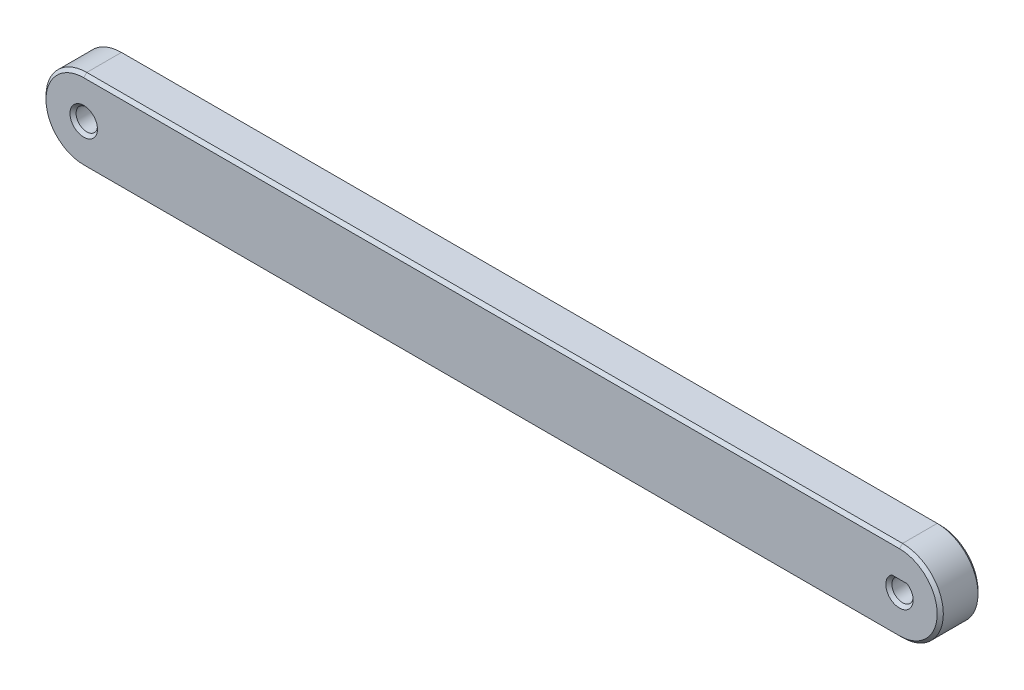
ISO-10303-21;
HEADER;
FILE_DESCRIPTION(('STEP AP214'),'2;1');
FILE_NAME('part.step','',(''),(''),'','','');
FILE_SCHEMA(('AUTOMOTIVE_DESIGN { 1 0 10303 214 1 1 1 1 }'));
ENDSEC;
DATA;
#1=APPLICATION_CONTEXT('core data for automotive mechanical design processes');
#2=APPLICATION_PROTOCOL_DEFINITION('international standard','automotive_design',2000,#1);
#3=PRODUCT_CONTEXT('',#1,'mechanical');
#4=PRODUCT('Part','Part','',(#3));
#5=PRODUCT_RELATED_PRODUCT_CATEGORY('part','',(#4));
#6=PRODUCT_DEFINITION_FORMATION('','',#4);
#7=PRODUCT_DEFINITION_CONTEXT('part definition',#1,'design');
#8=PRODUCT_DEFINITION('design','',#6,#7);
#9=PRODUCT_DEFINITION_SHAPE('','',#8);
#10=(LENGTH_UNIT() NAMED_UNIT(*) SI_UNIT(.MILLI.,.METRE.));
#11=(NAMED_UNIT(*) PLANE_ANGLE_UNIT() SI_UNIT($,.RADIAN.));
#12=(NAMED_UNIT(*) SI_UNIT($,.STERADIAN.) SOLID_ANGLE_UNIT());
#13=UNCERTAINTY_MEASURE_WITH_UNIT(LENGTH_MEASURE(1.E-05),#10,'distance_accuracy_value','');
#14=(GEOMETRIC_REPRESENTATION_CONTEXT(3) GLOBAL_UNCERTAINTY_ASSIGNED_CONTEXT((#13)) GLOBAL_UNIT_ASSIGNED_CONTEXT((#10,
#11,#12)) REPRESENTATION_CONTEXT('',''));
#15=CARTESIAN_POINT('',(0.,0.,0.));
#16=DIRECTION('',(0.,0.,1.));
#17=DIRECTION('',(1.,0.,0.));
#18=AXIS2_PLACEMENT_3D('',#15,#16,#17);
#19=CARTESIAN_POINT('',(-100.,0.,10.));
#20=DIRECTION('',(0.,0.,-1.));
#21=DIRECTION('',(-1.,0.,0.));
#22=AXIS2_PLACEMENT_3D('',#19,#20,#21);
#23=CYLINDRICAL_SURFACE('',#22,2.625);
#24=CARTESIAN_POINT('',(-100.,0.,4.75));
#25=DIRECTION('',(0.,0.,-1.));
#26=DIRECTION('',(-1.,0.,0.));
#27=AXIS2_PLACEMENT_3D('',#24,#25,#26);
#28=CIRCLE('',#27,2.625);
#29=CARTESIAN_POINT('',(-102.625,0.,4.75));
#30=VERTEX_POINT('',#29);
#31=EDGE_CURVE('E403',#30,#30,#28,.T.);
#32=ORIENTED_EDGE('',*,*,#31,.T.);
#33=EDGE_LOOP('',(#32));
#34=FACE_BOUND('',#33,.T.);
#35=CARTESIAN_POINT('',(-100.,0.,9.25));
#36=DIRECTION('',(0.,0.,1.));
#37=DIRECTION('',(1.,0.,0.));
#38=AXIS2_PLACEMENT_3D('',#35,#36,#37);
#39=CIRCLE('',#38,2.625);
#40=CARTESIAN_POINT('',(-97.375,0.,9.25));
#41=VERTEX_POINT('',#40);
#42=EDGE_CURVE('E392',#41,#41,#39,.T.);
#43=ORIENTED_EDGE('',*,*,#42,.T.);
#44=EDGE_LOOP('',(#43));
#45=FACE_BOUND('',#44,.T.);
#46=ADVANCED_FACE('F37',(#34,#45),#23,.F.);
#47=CARTESIAN_POINT('',(100.,0.,10.));
#48=DIRECTION('',(0.,0.,-1.));
#49=DIRECTION('',(-1.,0.,0.));
#50=AXIS2_PLACEMENT_3D('',#47,#48,#49);
#51=CYLINDRICAL_SURFACE('',#50,2.6);
#52=DIRECTION('',(0.,0.,-1.));
#53=VECTOR('',#52,1.);
#54=CARTESIAN_POINT('',(101.661324772584,2.,10.));
#55=LINE('',#54,#53);
#56=CARTESIAN_POINT('',(101.661324772584,2.,9.25));
#57=VERTEX_POINT('',#56);
#58=CARTESIAN_POINT('',(101.661324772584,2.,0.750000000000035));
#59=VERTEX_POINT('',#58);
#60=EDGE_CURVE('E388',#57,#59,#55,.T.);
#61=ORIENTED_EDGE('',*,*,#60,.T.);
#62=CARTESIAN_POINT('',(100.,0.,0.750000000000035));
#63=DIRECTION('',(0.,0.,1.));
#64=DIRECTION('',(1.,0.,0.));
#65=AXIS2_PLACEMENT_3D('',#62,#63,#64);
#66=CIRCLE('',#65,2.6);
#67=CARTESIAN_POINT('',(98.3386752274164,2.,0.750000000000035));
#68=VERTEX_POINT('',#67);
#69=EDGE_CURVE('E11',#59,#68,#66,.F.);
#70=ORIENTED_EDGE('',*,*,#69,.T.);
#71=DIRECTION('',(0.,0.,-1.));
#72=VECTOR('',#71,1.);
#73=CARTESIAN_POINT('',(98.3386752274164,2.,10.));
#74=LINE('',#73,#72);
#75=CARTESIAN_POINT('',(98.3386752274164,2.,9.25));
#76=VERTEX_POINT('',#75);
#77=EDGE_CURVE('E390',#76,#68,#74,.T.);
#78=ORIENTED_EDGE('',*,*,#77,.F.);
#79=CARTESIAN_POINT('',(100.,0.,9.25));
#80=DIRECTION('',(0.,0.,1.));
#81=DIRECTION('',(1.,0.,0.));
#82=AXIS2_PLACEMENT_3D('',#79,#80,#81);
#83=CIRCLE('',#82,2.6);
#84=EDGE_CURVE('E52',#76,#57,#83,.T.);
#85=ORIENTED_EDGE('',*,*,#84,.T.);
#86=EDGE_LOOP('',(#61,#70,#78,#85));
#87=FACE_BOUND('',#86,.T.);
#88=ADVANCED_FACE('F266',(#87),#51,.F.);
#89=CARTESIAN_POINT('',(0.,-10.,10.));
#90=DIRECTION('',(0.,-1.,0.));
#91=DIRECTION('',(1.,0.,0.));
#92=AXIS2_PLACEMENT_3D('',#89,#90,#91);
#93=PLANE('',#92);
#94=DIRECTION('',(0.,0.,-1.));
#95=VECTOR('',#94,1.);
#96=CARTESIAN_POINT('',(100.,-10.,10.));
#97=LINE('',#96,#95);
#98=CARTESIAN_POINT('',(100.,-10.,9.25));
#99=VERTEX_POINT('',#98);
#100=CARTESIAN_POINT('',(100.,-10.,0.750000000000001));
#101=VERTEX_POINT('',#100);
#102=EDGE_CURVE('E391',#99,#101,#97,.T.);
#103=ORIENTED_EDGE('',*,*,#102,.F.);
#104=DIRECTION('',(-1.,0.,0.));
#105=VECTOR('',#104,1.);
#106=CARTESIAN_POINT('',(0.,-10.,9.25));
#107=LINE('',#106,#105);
#108=CARTESIAN_POINT('',(-100.,-10.,9.25));
#109=VERTEX_POINT('',#108);
#110=EDGE_CURVE('E164',#99,#109,#107,.T.);
#111=ORIENTED_EDGE('',*,*,#110,.T.);
#112=DIRECTION('',(0.,0.,-1.));
#113=VECTOR('',#112,1.);
#114=CARTESIAN_POINT('',(-100.,-10.,10.));
#115=LINE('',#114,#113);
#116=CARTESIAN_POINT('',(-100.,-10.,0.750000000000001));
#117=VERTEX_POINT('',#116);
#118=EDGE_CURVE('E382',#109,#117,#115,.T.);
#119=ORIENTED_EDGE('',*,*,#118,.T.);
#120=DIRECTION('',(1.,0.,0.));
#121=VECTOR('',#120,1.);
#122=CARTESIAN_POINT('',(100.,-10.,0.750000000000001));
#123=LINE('',#122,#121);
#124=EDGE_CURVE('E161',#117,#101,#123,.T.);
#125=ORIENTED_EDGE('',*,*,#124,.T.);
#126=EDGE_LOOP('',(#103,#111,#119,#125));
#127=FACE_BOUND('',#126,.T.);
#128=ADVANCED_FACE('F272',(#127),#93,.T.);
#129=CARTESIAN_POINT('',(100.,0.,10.));
#130=DIRECTION('',(0.,0.,-1.));
#131=DIRECTION('',(-1.,0.,0.));
#132=AXIS2_PLACEMENT_3D('',#129,#130,#131);
#133=CYLINDRICAL_SURFACE('',#132,9.99999999999998);
#134=DIRECTION('',(0.,0.,-1.));
#135=VECTOR('',#134,1.);
#136=CARTESIAN_POINT('',(100.,9.99999999999998,10.));
#137=LINE('',#136,#135);
#138=CARTESIAN_POINT('',(100.,9.99999999999998,9.25));
#139=VERTEX_POINT('',#138);
#140=CARTESIAN_POINT('',(100.,9.99999999999998,0.750000000000001));
#141=VERTEX_POINT('',#140);
#142=EDGE_CURVE('E396',#139,#141,#137,.T.);
#143=ORIENTED_EDGE('',*,*,#142,.F.);
#144=CARTESIAN_POINT('',(100.,0.,9.25));
#145=DIRECTION('',(0.,0.,1.));
#146=DIRECTION('',(1.,0.,0.));
#147=AXIS2_PLACEMENT_3D('',#144,#145,#146);
#148=CIRCLE('',#147,9.99999999999998);
#149=EDGE_CURVE('E173',#139,#99,#148,.F.);
#150=ORIENTED_EDGE('',*,*,#149,.T.);
#151=ORIENTED_EDGE('',*,*,#102,.T.);
#152=CARTESIAN_POINT('',(100.,0.,0.750000000000001));
#153=DIRECTION('',(0.,0.,1.));
#154=DIRECTION('',(1.,0.,0.));
#155=AXIS2_PLACEMENT_3D('',#152,#153,#154);
#156=CIRCLE('',#155,9.99999999999998);
#157=EDGE_CURVE('E171',#101,#141,#156,.T.);
#158=ORIENTED_EDGE('',*,*,#157,.T.);
#159=EDGE_LOOP('',(#143,#150,#151,#158));
#160=FACE_BOUND('',#159,.T.);
#161=ADVANCED_FACE('F286',(#160),#133,.T.);
#162=CARTESIAN_POINT('',(0.,9.99999999999998,10.));
#163=DIRECTION('',(0.,1.,0.));
#164=DIRECTION('',(0.,0.,1.));
#165=AXIS2_PLACEMENT_3D('',#162,#163,#164);
#166=PLANE('',#165);
#167=DIRECTION('',(0.,0.,-1.));
#168=VECTOR('',#167,1.);
#169=CARTESIAN_POINT('',(-100.,9.99999999999998,10.));
#170=LINE('',#169,#168);
#171=CARTESIAN_POINT('',(-100.,9.99999999999998,9.25));
#172=VERTEX_POINT('',#171);
#173=CARTESIAN_POINT('',(-100.,9.99999999999998,0.750000000000001));
#174=VERTEX_POINT('',#173);
#175=EDGE_CURVE('E385',#172,#174,#170,.T.);
#176=ORIENTED_EDGE('',*,*,#175,.F.);
#177=DIRECTION('',(1.,0.,0.));
#178=VECTOR('',#177,1.);
#179=CARTESIAN_POINT('',(0.,9.99999999999998,9.25));
#180=LINE('',#179,#178);
#181=EDGE_CURVE('E177',#172,#139,#180,.T.);
#182=ORIENTED_EDGE('',*,*,#181,.T.);
#183=ORIENTED_EDGE('',*,*,#142,.T.);
#184=DIRECTION('',(-1.,0.,0.));
#185=VECTOR('',#184,1.);
#186=CARTESIAN_POINT('',(-100.,9.99999999999998,0.750000000000001));
#187=LINE('',#186,#185);
#188=EDGE_CURVE('E175',#141,#174,#187,.T.);
#189=ORIENTED_EDGE('',*,*,#188,.T.);
#190=EDGE_LOOP('',(#176,#182,#183,#189));
#191=FACE_BOUND('',#190,.T.);
#192=ADVANCED_FACE('F282',(#191),#166,.T.);
#193=CARTESIAN_POINT('',(-100.,0.,10.));
#194=DIRECTION('',(0.,0.,-1.));
#195=DIRECTION('',(-1.,0.,0.));
#196=AXIS2_PLACEMENT_3D('',#193,#194,#195);
#197=CYLINDRICAL_SURFACE('',#196,10.);
#198=ORIENTED_EDGE('',*,*,#118,.F.);
#199=CARTESIAN_POINT('',(-100.,0.,9.25));
#200=DIRECTION('',(0.,0.,1.));
#201=DIRECTION('',(1.,0.,0.));
#202=AXIS2_PLACEMENT_3D('',#199,#200,#201);
#203=CIRCLE('',#202,10.);
#204=EDGE_CURVE('E169',#109,#172,#203,.F.);
#205=ORIENTED_EDGE('',*,*,#204,.T.);
#206=ORIENTED_EDGE('',*,*,#175,.T.);
#207=CARTESIAN_POINT('',(-100.,0.,0.750000000000001));
#208=DIRECTION('',(0.,0.,1.));
#209=DIRECTION('',(1.,0.,0.));
#210=AXIS2_PLACEMENT_3D('',#207,#208,#209);
#211=CIRCLE('',#210,10.);
#212=EDGE_CURVE('E167',#174,#117,#211,.T.);
#213=ORIENTED_EDGE('',*,*,#212,.T.);
#214=EDGE_LOOP('',(#198,#205,#206,#213));
#215=FACE_BOUND('',#214,.T.);
#216=ADVANCED_FACE('F278',(#215),#197,.T.);
#217=CARTESIAN_POINT('',(0.,2.,10.));
#218=DIRECTION('',(0.,1.,0.));
#219=DIRECTION('',(0.,0.,1.));
#220=AXIS2_PLACEMENT_3D('',#217,#218,#219);
#221=PLANE('',#220);
#222=ORIENTED_EDGE('',*,*,#77,.T.);
#223=DIRECTION('',(1.,0.,0.));
#224=VECTOR('',#223,1.);
#225=CARTESIAN_POINT('',(0.,2.,0.750000000000035));
#226=LINE('',#225,#224);
#227=EDGE_CURVE('E200',#68,#59,#226,.T.);
#228=ORIENTED_EDGE('',*,*,#227,.T.);
#229=ORIENTED_EDGE('',*,*,#60,.F.);
#230=DIRECTION('',(-1.,0.,0.));
#231=VECTOR('',#230,1.);
#232=CARTESIAN_POINT('',(98.3386752274164,2.,9.25));
#233=LINE('',#232,#231);
#234=EDGE_CURVE('E139',#57,#76,#233,.T.);
#235=ORIENTED_EDGE('',*,*,#234,.T.);
#236=EDGE_LOOP('',(#222,#228,#229,#235));
#237=FACE_BOUND('',#236,.T.);
#238=ADVANCED_FACE('F281',(#237),#221,.F.);
#239=CARTESIAN_POINT('',(0.,0.,10.));
#240=DIRECTION('',(0.,0.,1.));
#241=DIRECTION('',(1.,0.,0.));
#242=AXIS2_PLACEMENT_3D('',#239,#240,#241);
#243=PLANE('',#242);
#244=CARTESIAN_POINT('',(-100.,0.,10.));
#245=DIRECTION('',(0.,0.,1.));
#246=DIRECTION('',(1.,0.,0.));
#247=AXIS2_PLACEMENT_3D('',#244,#245,#246);
#248=CIRCLE('',#247,3.37499999999999);
#249=CARTESIAN_POINT('',(-96.625,0.,10.));
#250=VERTEX_POINT('',#249);
#251=EDGE_CURVE('E158',#250,#250,#248,.F.);
#252=ORIENTED_EDGE('',*,*,#251,.T.);
#253=EDGE_LOOP('',(#252));
#254=FACE_BOUND('',#253,.T.);
#255=CARTESIAN_POINT('',(-100.,0.,10.));
#256=DIRECTION('',(0.,0.,1.));
#257=DIRECTION('',(1.,0.,0.));
#258=AXIS2_PLACEMENT_3D('',#255,#256,#257);
#259=CIRCLE('',#258,9.25);
#260=CARTESIAN_POINT('',(-100.,9.24999999999998,10.));
#261=VERTEX_POINT('',#260);
#262=CARTESIAN_POINT('',(-100.,-9.25000000000002,10.));
#263=VERTEX_POINT('',#262);
#264=EDGE_CURVE('E153',#261,#263,#259,.T.);
#265=ORIENTED_EDGE('',*,*,#264,.T.);
#266=DIRECTION('',(1.,0.,0.));
#267=VECTOR('',#266,1.);
#268=CARTESIAN_POINT('',(0.,-9.25000000000001,10.));
#269=LINE('',#268,#267);
#270=CARTESIAN_POINT('',(100.,-9.24999999999998,10.));
#271=VERTEX_POINT('',#270);
#272=EDGE_CURVE('E155',#263,#271,#269,.T.);
#273=ORIENTED_EDGE('',*,*,#272,.T.);
#274=CARTESIAN_POINT('',(100.,0.,10.));
#275=DIRECTION('',(0.,0.,1.));
#276=DIRECTION('',(1.,0.,0.));
#277=AXIS2_PLACEMENT_3D('',#274,#275,#276);
#278=CIRCLE('',#277,9.24999999999998);
#279=CARTESIAN_POINT('',(100.,9.24999999999998,10.));
#280=VERTEX_POINT('',#279);
#281=EDGE_CURVE('E148',#271,#280,#278,.T.);
#282=ORIENTED_EDGE('',*,*,#281,.T.);
#283=DIRECTION('',(-1.,0.,0.));
#284=VECTOR('',#283,1.);
#285=CARTESIAN_POINT('',(0.,9.24999999999998,10.));
#286=LINE('',#285,#284);
#287=EDGE_CURVE('E146',#280,#261,#286,.T.);
#288=ORIENTED_EDGE('',*,*,#287,.T.);
#289=EDGE_LOOP('',(#265,#273,#282,#288));
#290=FACE_BOUND('',#289,.T.);
#291=CARTESIAN_POINT('',(100.,0.,10.));
#292=DIRECTION('',(0.,0.,1.));
#293=DIRECTION('',(1.,0.,0.));
#294=AXIS2_PLACEMENT_3D('',#291,#292,#293);
#295=CIRCLE('',#294,3.35000000000002);
#296=CARTESIAN_POINT('',(101.913112646971,2.75000000000001,10.));
#297=VERTEX_POINT('',#296);
#298=CARTESIAN_POINT('',(98.0868873530291,2.75000000000001,10.));
#299=VERTEX_POINT('',#298);
#300=EDGE_CURVE('E141',#297,#299,#295,.F.);
#301=ORIENTED_EDGE('',*,*,#300,.T.);
#302=DIRECTION('',(1.,0.,0.));
#303=VECTOR('',#302,1.);
#304=CARTESIAN_POINT('',(101.661324772584,2.75000000000002,10.));
#305=LINE('',#304,#303);
#306=EDGE_CURVE('E137',#299,#297,#305,.T.);
#307=ORIENTED_EDGE('',*,*,#306,.T.);
#308=EDGE_LOOP('',(#301,#307));
#309=FACE_BOUND('',#308,.T.);
#310=ADVANCED_FACE('F145',(#254,#290,#309),#243,.T.);
#311=CARTESIAN_POINT('',(0.,0.,0.));
#312=DIRECTION('',(0.,0.,1.));
#313=DIRECTION('',(1.,0.,0.));
#314=AXIS2_PLACEMENT_3D('',#311,#312,#313);
#315=PLANE('',#314);
#316=CARTESIAN_POINT('',(100.,0.,0.));
#317=DIRECTION('',(0.,0.,1.));
#318=DIRECTION('',(1.,0.,0.));
#319=AXIS2_PLACEMENT_3D('',#316,#317,#318);
#320=CIRCLE('',#319,9.24999999999998);
#321=CARTESIAN_POINT('',(100.,9.24999999999998,0.));
#322=VERTEX_POINT('',#321);
#323=CARTESIAN_POINT('',(100.,-9.24999999999998,0.));
#324=VERTEX_POINT('',#323);
#325=EDGE_CURVE('E189',#322,#324,#320,.F.);
#326=ORIENTED_EDGE('',*,*,#325,.T.);
#327=DIRECTION('',(-1.,0.,0.));
#328=VECTOR('',#327,1.);
#329=CARTESIAN_POINT('',(-100.,-9.25000000000002,0.));
#330=LINE('',#329,#328);
#331=CARTESIAN_POINT('',(-100.,-9.25000000000002,0.));
#332=VERTEX_POINT('',#331);
#333=EDGE_CURVE('E193',#324,#332,#330,.T.);
#334=ORIENTED_EDGE('',*,*,#333,.T.);
#335=CARTESIAN_POINT('',(-100.,0.,0.));
#336=DIRECTION('',(0.,0.,1.));
#337=DIRECTION('',(1.,0.,0.));
#338=AXIS2_PLACEMENT_3D('',#335,#336,#337);
#339=CIRCLE('',#338,9.25);
#340=CARTESIAN_POINT('',(-100.,9.24999999999998,0.));
#341=VERTEX_POINT('',#340);
#342=EDGE_CURVE('E191',#332,#341,#339,.F.);
#343=ORIENTED_EDGE('',*,*,#342,.T.);
#344=DIRECTION('',(1.,0.,0.));
#345=VECTOR('',#344,1.);
#346=CARTESIAN_POINT('',(100.,9.24999999999998,0.));
#347=LINE('',#346,#345);
#348=EDGE_CURVE('E187',#341,#322,#347,.T.);
#349=ORIENTED_EDGE('',*,*,#348,.T.);
#350=EDGE_LOOP('',(#326,#334,#343,#349));
#351=FACE_BOUND('',#350,.T.);
#352=CARTESIAN_POINT('',(-100.,0.,0.));
#353=DIRECTION('',(0.,0.,1.));
#354=DIRECTION('',(1.,0.,0.));
#355=AXIS2_PLACEMENT_3D('',#352,#353,#354);
#356=CIRCLE('',#355,7.24999999999998);
#357=CARTESIAN_POINT('',(-92.75,0.,0.));
#358=VERTEX_POINT('',#357);
#359=EDGE_CURVE('E184',#358,#358,#356,.T.);
#360=ORIENTED_EDGE('',*,*,#359,.T.);
#361=EDGE_LOOP('',(#360));
#362=FACE_BOUND('',#361,.T.);
#363=CARTESIAN_POINT('',(100.,0.,0.));
#364=DIRECTION('',(0.,0.,1.));
#365=DIRECTION('',(1.,0.,0.));
#366=AXIS2_PLACEMENT_3D('',#363,#364,#365);
#367=CIRCLE('',#366,3.35000000000005);
#368=CARTESIAN_POINT('',(98.0868873530291,2.75000000000005,0.));
#369=VERTEX_POINT('',#368);
#370=CARTESIAN_POINT('',(101.913112646971,2.75000000000005,0.));
#371=VERTEX_POINT('',#370);
#372=EDGE_CURVE('E179',#369,#371,#367,.T.);
#373=ORIENTED_EDGE('',*,*,#372,.T.);
#374=DIRECTION('',(-1.,0.,0.));
#375=VECTOR('',#374,1.);
#376=CARTESIAN_POINT('',(0.,2.75000000000004,0.));
#377=LINE('',#376,#375);
#378=EDGE_CURVE('E181',#371,#369,#377,.T.);
#379=ORIENTED_EDGE('',*,*,#378,.T.);
#380=EDGE_LOOP('',(#373,#379));
#381=FACE_BOUND('',#380,.T.);
#382=ADVANCED_FACE('F377',(#351,#362,#381),#315,.F.);
#383=CARTESIAN_POINT('',(-100.,0.,4.));
#384=DIRECTION('',(0.,0.,-1.));
#385=DIRECTION('',(-1.,0.,0.));
#386=AXIS2_PLACEMENT_3D('',#383,#384,#385);
#387=CYLINDRICAL_SURFACE('',#386,6.5);
#388=CARTESIAN_POINT('',(-100.,0.,0.75));
#389=DIRECTION('',(0.,0.,1.));
#390=DIRECTION('',(1.,0.,0.));
#391=AXIS2_PLACEMENT_3D('',#388,#389,#390);
#392=CIRCLE('',#391,6.5);
#393=CARTESIAN_POINT('',(-93.5,0.,0.75));
#394=VERTEX_POINT('',#393);
#395=EDGE_CURVE('E196',#394,#394,#392,.F.);
#396=ORIENTED_EDGE('',*,*,#395,.T.);
#397=EDGE_LOOP('',(#396));
#398=FACE_BOUND('',#397,.T.);
#399=CARTESIAN_POINT('',(-100.,0.,4.));
#400=DIRECTION('',(0.,0.,-1.));
#401=DIRECTION('',(-1.,0.,0.));
#402=AXIS2_PLACEMENT_3D('',#399,#400,#401);
#403=CIRCLE('',#402,6.5);
#404=CARTESIAN_POINT('',(-106.5,0.,4.));
#405=VERTEX_POINT('',#404);
#406=EDGE_CURVE('E215',#405,#405,#403,.T.);
#407=ORIENTED_EDGE('',*,*,#406,.F.);
#408=EDGE_LOOP('',(#407));
#409=FACE_BOUND('',#408,.T.);
#410=ADVANCED_FACE('F374',(#398,#409),#387,.F.);
#411=CARTESIAN_POINT('',(-100.,0.,4.));
#412=DIRECTION('',(0.,0.,-1.));
#413=DIRECTION('',(-1.,0.,0.));
#414=AXIS2_PLACEMENT_3D('',#411,#412,#413);
#415=PLANE('',#414);
#416=CARTESIAN_POINT('',(-100.,0.,4.));
#417=DIRECTION('',(0.,0.,-1.));
#418=DIRECTION('',(-1.,0.,0.));
#419=AXIS2_PLACEMENT_3D('',#416,#417,#418);
#420=CIRCLE('',#419,3.37499999999999);
#421=CARTESIAN_POINT('',(-103.375,0.,4.));
#422=VERTEX_POINT('',#421);
#423=EDGE_CURVE('E143',#422,#422,#420,.F.);
#424=ORIENTED_EDGE('',*,*,#423,.T.);
#425=EDGE_LOOP('',(#424));
#426=FACE_BOUND('',#425,.T.);
#427=ORIENTED_EDGE('',*,*,#406,.T.);
#428=EDGE_LOOP('',(#427));
#429=FACE_BOUND('',#428,.T.);
#430=ADVANCED_FACE('F302',(#426,#429),#415,.T.);
#431=CARTESIAN_POINT('',(-100.,0.,4.75));
#432=DIRECTION('',(0.,0.,-1.));
#433=DIRECTION('',(-1.,0.,0.));
#434=AXIS2_PLACEMENT_3D('',#431,#432,#433);
#435=CONICAL_SURFACE('',#434,2.625,0.785398163397442);
#436=ORIENTED_EDGE('',*,*,#423,.F.);
#437=EDGE_LOOP('',(#436));
#438=FACE_BOUND('',#437,.T.);
#439=ORIENTED_EDGE('',*,*,#31,.F.);
#440=EDGE_LOOP('',(#439));
#441=FACE_BOUND('',#440,.T.);
#442=ADVANCED_FACE('F295',(#438,#441),#435,.F.);
#443=CARTESIAN_POINT('',(-100.,0.,9.25));
#444=DIRECTION('',(0.,0.,1.));
#445=DIRECTION('',(1.,0.,0.));
#446=AXIS2_PLACEMENT_3D('',#443,#444,#445);
#447=CONICAL_SURFACE('',#446,2.625,0.785398163397438);
#448=ORIENTED_EDGE('',*,*,#251,.F.);
#449=EDGE_LOOP('',(#448));
#450=FACE_BOUND('',#449,.T.);
#451=ORIENTED_EDGE('',*,*,#42,.F.);
#452=EDGE_LOOP('',(#451));
#453=FACE_BOUND('',#452,.T.);
#454=ADVANCED_FACE('F301',(#450,#453),#447,.F.);
#455=CARTESIAN_POINT('',(0.,9.99999999999998,9.25));
#456=DIRECTION('',(0.,-0.707106781186547,-0.707106781186547));
#457=DIRECTION('',(1.,0.,0.));
#458=AXIS2_PLACEMENT_3D('',#455,#456,#457);
#459=PLANE('',#458);
#460=DIRECTION('',(0.,0.707106781186547,-0.707106781186547));
#461=VECTOR('',#460,1.);
#462=CARTESIAN_POINT('',(-100.,9.24999999999998,10.));
#463=LINE('',#462,#461);
#464=EDGE_CURVE('E209',#261,#172,#463,.T.);
#465=ORIENTED_EDGE('',*,*,#464,.F.);
#466=ORIENTED_EDGE('',*,*,#287,.F.);
#467=DIRECTION('',(0.,-0.707106781186547,0.707106781186547));
#468=VECTOR('',#467,1.);
#469=CARTESIAN_POINT('',(100.,9.99999999999998,9.25));
#470=LINE('',#469,#468);
#471=EDGE_CURVE('E212',#139,#280,#470,.T.);
#472=ORIENTED_EDGE('',*,*,#471,.F.);
#473=ORIENTED_EDGE('',*,*,#181,.F.);
#474=EDGE_LOOP('',(#465,#466,#472,#473));
#475=FACE_BOUND('',#474,.T.);
#476=ADVANCED_FACE('F309',(#475),#459,.F.);
#477=CARTESIAN_POINT('',(100.,0.,9.25));
#478=DIRECTION('',(0.,0.,-1.));
#479=DIRECTION('',(-1.,0.,0.));
#480=AXIS2_PLACEMENT_3D('',#477,#478,#479);
#481=CONICAL_SURFACE('',#480,9.99999999999998,0.785398163397448);
#482=ORIENTED_EDGE('',*,*,#471,.T.);
#483=ORIENTED_EDGE('',*,*,#281,.F.);
#484=DIRECTION('',(0.,0.707106781186547,0.707106781186547));
#485=VECTOR('',#484,1.);
#486=CARTESIAN_POINT('',(100.,-9.99999999999998,9.25));
#487=LINE('',#486,#485);
#488=EDGE_CURVE('E206',#99,#271,#487,.T.);
#489=ORIENTED_EDGE('',*,*,#488,.F.);
#490=ORIENTED_EDGE('',*,*,#149,.F.);
#491=EDGE_LOOP('',(#482,#483,#489,#490));
#492=FACE_BOUND('',#491,.T.);
#493=ADVANCED_FACE('F327',(#492),#481,.T.);
#494=CARTESIAN_POINT('',(-100.,0.,10.));
#495=DIRECTION('',(0.,0.,-1.));
#496=DIRECTION('',(-1.,0.,0.));
#497=AXIS2_PLACEMENT_3D('',#494,#495,#496);
#498=CONICAL_SURFACE('',#497,9.25,0.785398163397448);
#499=ORIENTED_EDGE('',*,*,#464,.T.);
#500=ORIENTED_EDGE('',*,*,#204,.F.);
#501=DIRECTION('',(0.,-0.707106781186547,-0.707106781186547));
#502=VECTOR('',#501,1.);
#503=CARTESIAN_POINT('',(-100.,-9.25000000000002,10.));
#504=LINE('',#503,#502);
#505=EDGE_CURVE('E204',#263,#109,#504,.T.);
#506=ORIENTED_EDGE('',*,*,#505,.F.);
#507=ORIENTED_EDGE('',*,*,#264,.F.);
#508=EDGE_LOOP('',(#499,#500,#506,#507));
#509=FACE_BOUND('',#508,.T.);
#510=ADVANCED_FACE('F320',(#509),#498,.T.);
#511=CARTESIAN_POINT('',(0.,-10.,9.25));
#512=DIRECTION('',(0.,0.707106781186547,-0.707106781186547));
#513=DIRECTION('',(-1.,0.,0.));
#514=AXIS2_PLACEMENT_3D('',#511,#512,#513);
#515=PLANE('',#514);
#516=ORIENTED_EDGE('',*,*,#488,.T.);
#517=ORIENTED_EDGE('',*,*,#272,.F.);
#518=ORIENTED_EDGE('',*,*,#505,.T.);
#519=ORIENTED_EDGE('',*,*,#110,.F.);
#520=EDGE_LOOP('',(#516,#517,#518,#519));
#521=FACE_BOUND('',#520,.T.);
#522=ADVANCED_FACE('F312',(#521),#515,.F.);
#523=CARTESIAN_POINT('',(0.,9.24999999999998,0.));
#524=DIRECTION('',(0.,0.707106781186547,-0.707106781186547));
#525=DIRECTION('',(-1.,0.,0.));
#526=AXIS2_PLACEMENT_3D('',#523,#524,#525);
#527=PLANE('',#526);
#528=DIRECTION('',(0.,-0.707106781186547,-0.707106781186547));
#529=VECTOR('',#528,1.);
#530=CARTESIAN_POINT('',(-100.,9.99999999999998,0.750000000000001));
#531=LINE('',#530,#529);
#532=EDGE_CURVE('E221',#174,#341,#531,.T.);
#533=ORIENTED_EDGE('',*,*,#532,.F.);
#534=ORIENTED_EDGE('',*,*,#188,.F.);
#535=DIRECTION('',(0.,0.707106781186547,0.707106781186547));
#536=VECTOR('',#535,1.);
#537=CARTESIAN_POINT('',(100.,9.24999999999998,0.));
#538=LINE('',#537,#536);
#539=EDGE_CURVE('E207',#322,#141,#538,.T.);
#540=ORIENTED_EDGE('',*,*,#539,.F.);
#541=ORIENTED_EDGE('',*,*,#348,.F.);
#542=EDGE_LOOP('',(#533,#534,#540,#541));
#543=FACE_BOUND('',#542,.T.);
#544=ADVANCED_FACE('F319',(#543),#527,.T.);
#545=CARTESIAN_POINT('',(100.,0.,0.));
#546=DIRECTION('',(0.,0.,1.));
#547=DIRECTION('',(1.,0.,0.));
#548=AXIS2_PLACEMENT_3D('',#545,#546,#547);
#549=CONICAL_SURFACE('',#548,9.24999999999998,0.785398163397448);
#550=ORIENTED_EDGE('',*,*,#539,.T.);
#551=ORIENTED_EDGE('',*,*,#157,.F.);
#552=DIRECTION('',(0.,-0.707106781186547,0.707106781186547));
#553=VECTOR('',#552,1.);
#554=CARTESIAN_POINT('',(100.,-9.24999999999998,0.));
#555=LINE('',#554,#553);
#556=EDGE_CURVE('E218',#324,#101,#555,.T.);
#557=ORIENTED_EDGE('',*,*,#556,.F.);
#558=ORIENTED_EDGE('',*,*,#325,.F.);
#559=EDGE_LOOP('',(#550,#551,#557,#558));
#560=FACE_BOUND('',#559,.T.);
#561=ADVANCED_FACE('F353',(#560),#549,.T.);
#562=CARTESIAN_POINT('',(-100.,0.,0.750000000000001));
#563=DIRECTION('',(0.,0.,1.));
#564=DIRECTION('',(1.,0.,0.));
#565=AXIS2_PLACEMENT_3D('',#562,#563,#564);
#566=CONICAL_SURFACE('',#565,10.,0.785398163397448);
#567=ORIENTED_EDGE('',*,*,#532,.T.);
#568=ORIENTED_EDGE('',*,*,#342,.F.);
#569=DIRECTION('',(0.,0.707106781186547,-0.707106781186547));
#570=VECTOR('',#569,1.);
#571=CARTESIAN_POINT('',(-100.,-10.,0.750000000000001));
#572=LINE('',#571,#570);
#573=EDGE_CURVE('E216',#117,#332,#572,.T.);
#574=ORIENTED_EDGE('',*,*,#573,.F.);
#575=ORIENTED_EDGE('',*,*,#212,.F.);
#576=EDGE_LOOP('',(#567,#568,#574,#575));
#577=FACE_BOUND('',#576,.T.);
#578=ADVANCED_FACE('F346',(#577),#566,.T.);
#579=CARTESIAN_POINT('',(0.,-9.25000000000001,0.));
#580=DIRECTION('',(0.,-0.707106781186547,-0.707106781186547));
#581=DIRECTION('',(1.,0.,0.));
#582=AXIS2_PLACEMENT_3D('',#579,#580,#581);
#583=PLANE('',#582);
#584=ORIENTED_EDGE('',*,*,#556,.T.);
#585=ORIENTED_EDGE('',*,*,#124,.F.);
#586=ORIENTED_EDGE('',*,*,#573,.T.);
#587=ORIENTED_EDGE('',*,*,#333,.F.);
#588=EDGE_LOOP('',(#584,#585,#586,#587));
#589=FACE_BOUND('',#588,.T.);
#590=ADVANCED_FACE('F340',(#589),#583,.T.);
#591=CARTESIAN_POINT('',(-100.,0.,0.75));
#592=DIRECTION('',(0.,0.,-1.));
#593=DIRECTION('',(-1.,0.,0.));
#594=AXIS2_PLACEMENT_3D('',#591,#592,#593);
#595=CONICAL_SURFACE('',#594,6.5,0.785398163397433);
#596=ORIENTED_EDGE('',*,*,#359,.F.);
#597=EDGE_LOOP('',(#596));
#598=FACE_BOUND('',#597,.T.);
#599=ORIENTED_EDGE('',*,*,#395,.F.);
#600=EDGE_LOOP('',(#599));
#601=FACE_BOUND('',#600,.T.);
#602=ADVANCED_FACE('F249',(#598,#601),#595,.F.);
#603=CARTESIAN_POINT('',(100.,0.,0.));
#604=DIRECTION('',(0.,0.,-1.));
#605=DIRECTION('',(-1.,0.,0.));
#606=AXIS2_PLACEMENT_3D('',#603,#604,#605);
#607=CONICAL_SURFACE('',#606,3.35000000000005,0.785398163397454);
#608=CARTESIAN_POINT('',(101.661324772584,2.,0.750000000000035));
#609=CARTESIAN_POINT('',(101.68380250287,2.06224532531338,0.687754674686654));
#610=CARTESIAN_POINT('',(101.705856726763,2.12456655380696,0.625433446193075));
#611=CARTESIAN_POINT('',(101.749193660315,2.24933893682887,0.500661063171166));
#612=CARTESIAN_POINT('',(101.770476418214,2.31179008297424,0.438209917025801));
#613=CARTESIAN_POINT('',(101.812348319376,2.43680704212276,0.313192957877284));
#614=CARTESIAN_POINT('',(101.832937475739,2.49937285293658,0.250627147063465));
#615=CARTESIAN_POINT('',(101.873484121273,2.62461090613701,0.12538909386303));
#616=CARTESIAN_POINT('',(101.893441570833,2.68728315493909,0.0627168450609508));
#617=CARTESIAN_POINT('',(101.913112646971,2.75000000000004,0.));
#618=B_SPLINE_CURVE_WITH_KNOTS('',3,(#608,#609,#610,#611,#612,#613,#614,#615,#616,#617),
.UNSPECIFIED.,.F.,.F.,(4,2,2,2,4),(0.,0.272555874565069,0.545094676497957,0.817628327860232,
1.09017903437377),.UNSPECIFIED.);
#619=EDGE_CURVE('E226',#371,#59,#618,.F.);
#620=ORIENTED_EDGE('',*,*,#619,.F.);
#621=ORIENTED_EDGE('',*,*,#372,.F.);
#622=CARTESIAN_POINT('',(98.0868873530291,2.75000000000004,0.));
#623=CARTESIAN_POINT('',(98.1065584291665,2.68728315493909,0.0627168450609516));
#624=CARTESIAN_POINT('',(98.1265158787271,2.62461090613701,0.125389093863031));
#625=CARTESIAN_POINT('',(98.1670625242609,2.49937285293657,0.250627147063466));
#626=CARTESIAN_POINT('',(98.1876516806238,2.43680704212276,0.313192957877285));
#627=CARTESIAN_POINT('',(98.2295235817855,2.31179008297424,0.438209917025804));
#628=CARTESIAN_POINT('',(98.250806339685,2.24933893682887,0.500661063171169));
#629=CARTESIAN_POINT('',(98.2941432732372,2.12456655380696,0.625433446193078));
#630=CARTESIAN_POINT('',(98.3161974971304,2.06224532531338,0.687754674686656));
#631=CARTESIAN_POINT('',(98.3386752274164,2.,0.750000000000037));
#632=B_SPLINE_CURVE_WITH_KNOTS('',3,(#622,#623,#624,#625,#626,#627,#628,#629,#630,#631),
.UNSPECIFIED.,.F.,.F.,(4,2,2,2,4),(0.,0.272550706513541,0.545084357875817,0.817623159808708,
1.09017903437378),.UNSPECIFIED.);
#633=EDGE_CURVE('E219',#68,#369,#632,.F.);
#634=ORIENTED_EDGE('',*,*,#633,.F.);
#635=ORIENTED_EDGE('',*,*,#69,.F.);
#636=EDGE_LOOP('',(#620,#621,#634,#635));
#637=FACE_BOUND('',#636,.T.);
#638=ADVANCED_FACE('F243',(#637),#607,.F.);
#639=CARTESIAN_POINT('',(0.,2.,0.750000000000035));
#640=DIRECTION('',(0.,0.707106781186543,0.707106781186551));
#641=DIRECTION('',(1.,0.,0.));
#642=AXIS2_PLACEMENT_3D('',#639,#640,#641);
#643=PLANE('',#642);
#644=ORIENTED_EDGE('',*,*,#633,.T.);
#645=ORIENTED_EDGE('',*,*,#378,.F.);
#646=ORIENTED_EDGE('',*,*,#619,.T.);
#647=ORIENTED_EDGE('',*,*,#227,.F.);
#648=EDGE_LOOP('',(#644,#645,#646,#647));
#649=FACE_BOUND('',#648,.T.);
#650=ADVANCED_FACE('F239',(#649),#643,.F.);
#651=CARTESIAN_POINT('',(100.,0.,9.25));
#652=DIRECTION('',(0.,0.,1.));
#653=DIRECTION('',(1.,0.,0.));
#654=AXIS2_PLACEMENT_3D('',#651,#652,#653);
#655=CONICAL_SURFACE('',#654,2.6,0.785398163397456);
#656=CARTESIAN_POINT('',(101.913112646971,2.75000000000002,10.));
#657=CARTESIAN_POINT('',(101.893441570833,2.68728315493907,9.93728315493905));
#658=CARTESIAN_POINT('',(101.873484121273,2.62461090613699,9.87461090613698));
#659=CARTESIAN_POINT('',(101.832937475739,2.49937285293656,9.74937285293655));
#660=CARTESIAN_POINT('',(101.812348319376,2.43680704212274,9.68680704212273));
#661=CARTESIAN_POINT('',(101.770476418214,2.31179008297423,9.56179008297422));
#662=CARTESIAN_POINT('',(101.749193660315,2.24933893682886,9.49933893682885));
#663=CARTESIAN_POINT('',(101.705856726763,2.12456655380695,9.37456655380695));
#664=CARTESIAN_POINT('',(101.68380250287,2.06224532531338,9.31224532531337));
#665=CARTESIAN_POINT('',(101.661324772584,2.,9.24999999999999));
#666=B_SPLINE_CURVE_WITH_KNOTS('',3,(#656,#657,#658,#659,#660,#661,#662,#663,#664,#665),
.UNSPECIFIED.,.F.,.F.,(4,2,2,2,4),(0.,0.272550706513532,0.545084357875797,0.817623159808675,
1.09017903437373),.UNSPECIFIED.);
#667=EDGE_CURVE('E133',#57,#297,#666,.F.);
#668=ORIENTED_EDGE('',*,*,#667,.F.);
#669=ORIENTED_EDGE('',*,*,#84,.F.);
#670=CARTESIAN_POINT('',(98.3386752274164,2.,9.25));
#671=CARTESIAN_POINT('',(98.3161974971304,2.06224532531338,9.31224532531337));
#672=CARTESIAN_POINT('',(98.2941432732372,2.12456655380696,9.37456655380695));
#673=CARTESIAN_POINT('',(98.250806339685,2.24933893682886,9.49933893682886));
#674=CARTESIAN_POINT('',(98.2295235817856,2.31179008297423,9.56179008297422));
#675=CARTESIAN_POINT('',(98.1876516806239,2.43680704212274,9.68680704212273));
#676=CARTESIAN_POINT('',(98.1670625242609,2.49937285293656,9.74937285293655));
#677=CARTESIAN_POINT('',(98.1265158787271,2.62461090613699,9.87461090613698));
#678=CARTESIAN_POINT('',(98.1065584291665,2.68728315493907,9.93728315493905));
#679=CARTESIAN_POINT('',(98.0868873530291,2.75000000000002,10.));
#680=B_SPLINE_CURVE_WITH_KNOTS('',3,(#670,#671,#672,#673,#674,#675,#676,#677,#678,#679),
.UNSPECIFIED.,.F.,.F.,(4,2,2,2,4),(0.,0.27255587456506,0.545094676497935,0.817628327860199,
1.09017903437373),.UNSPECIFIED.);
#681=EDGE_CURVE('E43',#299,#76,#680,.F.);
#682=ORIENTED_EDGE('',*,*,#681,.F.);
#683=ORIENTED_EDGE('',*,*,#300,.F.);
#684=EDGE_LOOP('',(#668,#669,#682,#683));
#685=FACE_BOUND('',#684,.T.);
#686=ADVANCED_FACE('F40',(#685),#655,.F.);
#687=CARTESIAN_POINT('',(0.,2.75000000000002,10.));
#688=DIRECTION('',(0.,-0.707106781186542,0.707106781186553));
#689=DIRECTION('',(-1.,0.,0.));
#690=AXIS2_PLACEMENT_3D('',#687,#688,#689);
#691=PLANE('',#690);
#692=ORIENTED_EDGE('',*,*,#681,.T.);
#693=ORIENTED_EDGE('',*,*,#234,.F.);
#694=ORIENTED_EDGE('',*,*,#667,.T.);
#695=ORIENTED_EDGE('',*,*,#306,.F.);
#696=EDGE_LOOP('',(#692,#693,#694,#695));
#697=FACE_BOUND('',#696,.T.);
#698=ADVANCED_FACE('F135',(#697),#691,.T.);
#699=CLOSED_SHELL('',(#46,#88,#128,#161,#192,#216,#238,#310,#382,#410,#430,#442,#454,#476,#493,
#510,#522,#544,#561,#578,#590,#602,#638,#650,#686,#698));
#700=MANIFOLD_SOLID_BREP('B2',#699);
#701=ADVANCED_BREP_SHAPE_REPRESENTATION('',(#18,#700),#14);
#702=SHAPE_DEFINITION_REPRESENTATION(#9,#701);
ENDSEC;
END-ISO-10303-21;
